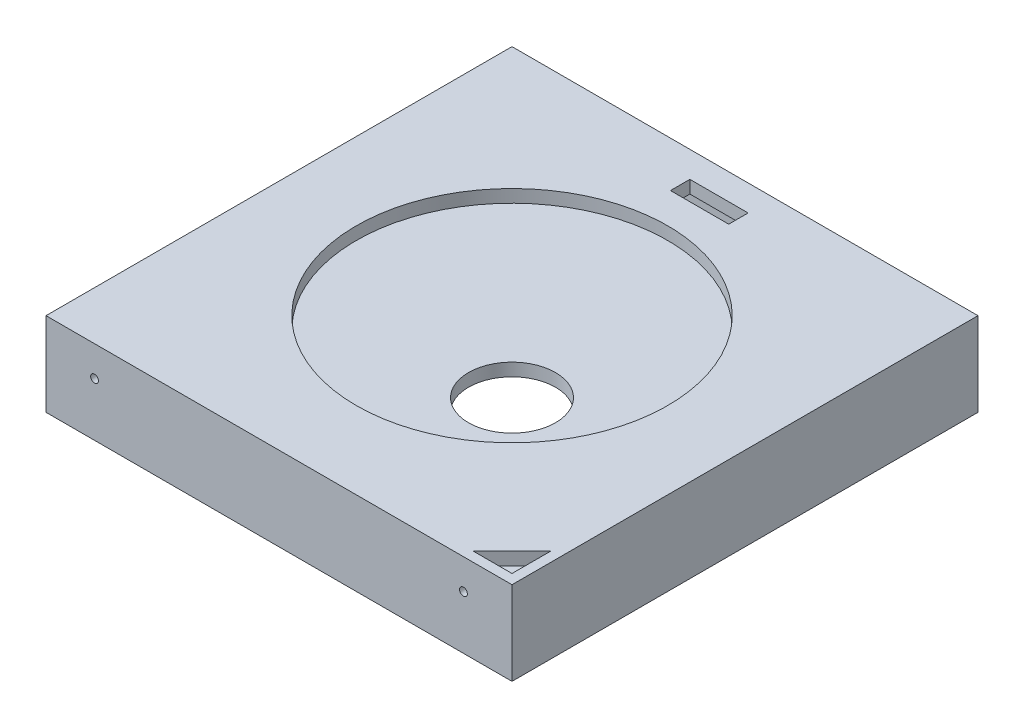
ISO-10303-21;
HEADER;
FILE_DESCRIPTION(('STEP AP214'),'2;1');
FILE_NAME('part.step','',(''),(''),'','','');
FILE_SCHEMA(('AUTOMOTIVE_DESIGN { 1 0 10303 214 1 1 1 1 }'));
ENDSEC;
DATA;
#1=APPLICATION_CONTEXT('core data for automotive mechanical design processes');
#2=APPLICATION_PROTOCOL_DEFINITION('international standard','automotive_design',2000,#1);
#3=PRODUCT_CONTEXT('',#1,'mechanical');
#4=PRODUCT('Part','Part','',(#3));
#5=PRODUCT_RELATED_PRODUCT_CATEGORY('part','',(#4));
#6=PRODUCT_DEFINITION_FORMATION('','',#4);
#7=PRODUCT_DEFINITION_CONTEXT('part definition',#1,'design');
#8=PRODUCT_DEFINITION('design','',#6,#7);
#9=PRODUCT_DEFINITION_SHAPE('','',#8);
#10=(LENGTH_UNIT() NAMED_UNIT(*) SI_UNIT(.MILLI.,.METRE.));
#11=(NAMED_UNIT(*) PLANE_ANGLE_UNIT() SI_UNIT($,.RADIAN.));
#12=(NAMED_UNIT(*) SI_UNIT($,.STERADIAN.) SOLID_ANGLE_UNIT());
#13=UNCERTAINTY_MEASURE_WITH_UNIT(LENGTH_MEASURE(1.E-05),#10,'distance_accuracy_value','');
#14=(GEOMETRIC_REPRESENTATION_CONTEXT(3) GLOBAL_UNCERTAINTY_ASSIGNED_CONTEXT((#13)) GLOBAL_UNIT_ASSIGNED_CONTEXT((#10,
#11,#12)) REPRESENTATION_CONTEXT('',''));
#15=CARTESIAN_POINT('',(0.,0.,0.));
#16=DIRECTION('',(0.,0.,1.));
#17=DIRECTION('',(1.,0.,0.));
#18=AXIS2_PLACEMENT_3D('',#15,#16,#17);
#19=CARTESIAN_POINT('',(134.387464788732,34.95802,177.746338028169));
#20=DIRECTION('',(0.,0.,1.));
#21=DIRECTION('',(1.,0.,0.));
#22=AXIS2_PLACEMENT_3D('',#19,#20,#21);
#23=CYLINDRICAL_SURFACE('',#22,2.53999999999998);
#24=CARTESIAN_POINT('',(134.387464788732,34.95802,209.496338028169));
#25=DIRECTION('',(0.,0.,1.));
#26=DIRECTION('',(1.,0.,0.));
#27=AXIS2_PLACEMENT_3D('',#24,#25,#26);
#28=CIRCLE('',#27,2.53999999999998);
#29=CARTESIAN_POINT('',(136.927464788732,34.95802,209.496338028169));
#30=VERTEX_POINT('',#29);
#31=EDGE_CURVE('E199',#30,#30,#28,.T.);
#32=ORIENTED_EDGE('',*,*,#31,.T.);
#33=EDGE_LOOP('',(#32));
#34=FACE_BOUND('',#33,.T.);
#35=CARTESIAN_POINT('',(134.387464788732,34.95802,203.146338028169));
#36=DIRECTION('',(0.,0.,1.));
#37=DIRECTION('',(1.,0.,0.));
#38=AXIS2_PLACEMENT_3D('',#35,#36,#37);
#39=CIRCLE('',#38,2.53999999999998);
#40=CARTESIAN_POINT('',(136.927464788732,34.95802,203.146338028169));
#41=VERTEX_POINT('',#40);
#42=EDGE_CURVE('E46',#41,#41,#39,.T.);
#43=ORIENTED_EDGE('',*,*,#42,.F.);
#44=EDGE_LOOP('',(#43));
#45=FACE_BOUND('',#44,.T.);
#46=ADVANCED_FACE('F37',(#34,#45),#23,.F.);
#47=CARTESIAN_POINT('',(-106.912535211268,34.95802,177.746338028169));
#48=DIRECTION('',(0.,0.,1.));
#49=DIRECTION('',(1.,0.,0.));
#50=AXIS2_PLACEMENT_3D('',#47,#48,#49);
#51=CYLINDRICAL_SURFACE('',#50,2.54);
#52=CARTESIAN_POINT('',(-106.912535211268,34.95802,209.496338028169));
#53=DIRECTION('',(0.,0.,1.));
#54=DIRECTION('',(1.,0.,0.));
#55=AXIS2_PLACEMENT_3D('',#52,#53,#54);
#56=CIRCLE('',#55,2.54);
#57=CARTESIAN_POINT('',(-104.372535211268,34.95802,209.496338028169));
#58=VERTEX_POINT('',#57);
#59=EDGE_CURVE('E198',#58,#58,#56,.T.);
#60=ORIENTED_EDGE('',*,*,#59,.T.);
#61=EDGE_LOOP('',(#60));
#62=FACE_BOUND('',#61,.T.);
#63=CARTESIAN_POINT('',(-106.912535211268,34.95802,203.146338028169));
#64=DIRECTION('',(0.,0.,-1.));
#65=DIRECTION('',(-1.,0.,0.));
#66=AXIS2_PLACEMENT_3D('',#63,#64,#65);
#67=CIRCLE('',#66,2.54);
#68=CARTESIAN_POINT('',(-109.452535211268,34.95802,203.146338028169));
#69=VERTEX_POINT('',#68);
#70=EDGE_CURVE('E151',#69,#69,#67,.F.);
#71=ORIENTED_EDGE('',*,*,#70,.F.);
#72=EDGE_LOOP('',(#71));
#73=FACE_BOUND('',#72,.T.);
#74=ADVANCED_FACE('F273',(#62,#73),#51,.F.);
#75=CARTESIAN_POINT('',(-138.662535211268,54.77002,-95.303661971831));
#76=DIRECTION('',(1.,0.,0.));
#77=DIRECTION('',(0.,0.,-1.));
#78=AXIS2_PLACEMENT_3D('',#75,#76,#77);
#79=PLANE('',#78);
#80=DIRECTION('',(0.,0.,1.));
#81=VECTOR('',#80,1.);
#82=CARTESIAN_POINT('',(-138.662535211268,0.,-95.303661971831));
#83=LINE('',#82,#81);
#84=CARTESIAN_POINT('',(-138.662535211268,0.,-95.303661971831));
#85=VERTEX_POINT('',#84);
#86=CARTESIAN_POINT('',(-138.662535211268,0.,209.496338028169));
#87=VERTEX_POINT('',#86);
#88=EDGE_CURVE('E237',#85,#87,#83,.T.);
#89=ORIENTED_EDGE('',*,*,#88,.T.);
#90=DIRECTION('',(0.,-1.,0.));
#91=VECTOR('',#90,1.);
#92=CARTESIAN_POINT('',(-138.662535211268,54.77002,209.496338028169));
#93=LINE('',#92,#91);
#94=CARTESIAN_POINT('',(-138.662535211268,54.77002,209.496338028169));
#95=VERTEX_POINT('',#94);
#96=EDGE_CURVE('E264',#95,#87,#93,.T.);
#97=ORIENTED_EDGE('',*,*,#96,.F.);
#98=DIRECTION('',(0.,0.,1.));
#99=VECTOR('',#98,1.);
#100=CARTESIAN_POINT('',(-138.662535211268,54.77002,-95.303661971831));
#101=LINE('',#100,#99);
#102=CARTESIAN_POINT('',(-138.662535211268,54.77002,-95.303661971831));
#103=VERTEX_POINT('',#102);
#104=EDGE_CURVE('E238',#103,#95,#101,.T.);
#105=ORIENTED_EDGE('',*,*,#104,.F.);
#106=DIRECTION('',(0.,-1.,0.));
#107=VECTOR('',#106,1.);
#108=CARTESIAN_POINT('',(-138.662535211268,54.77002,-95.303661971831));
#109=LINE('',#108,#107);
#110=EDGE_CURVE('E248',#103,#85,#109,.T.);
#111=ORIENTED_EDGE('',*,*,#110,.T.);
#112=EDGE_LOOP('',(#89,#97,#105,#111));
#113=FACE_BOUND('',#112,.T.);
#114=ADVANCED_FACE('F39',(#113),#79,.F.);
#115=CARTESIAN_POINT('',(-138.662535211268,54.77002,209.496338028169));
#116=DIRECTION('',(0.,0.,-1.));
#117=DIRECTION('',(-1.,0.,0.));
#118=AXIS2_PLACEMENT_3D('',#115,#116,#117);
#119=PLANE('',#118);
#120=ORIENTED_EDGE('',*,*,#31,.F.);
#121=EDGE_LOOP('',(#120));
#122=FACE_BOUND('',#121,.T.);
#123=ORIENTED_EDGE('',*,*,#59,.F.);
#124=EDGE_LOOP('',(#123));
#125=FACE_BOUND('',#124,.T.);
#126=DIRECTION('',(1.,0.,0.));
#127=VECTOR('',#126,1.);
#128=CARTESIAN_POINT('',(-138.662535211268,0.,209.496338028169));
#129=LINE('',#128,#127);
#130=CARTESIAN_POINT('',(166.137464788732,0.,209.496338028169));
#131=VERTEX_POINT('',#130);
#132=EDGE_CURVE('E251',#87,#131,#129,.T.);
#133=ORIENTED_EDGE('',*,*,#132,.T.);
#134=DIRECTION('',(0.,-1.,0.));
#135=VECTOR('',#134,1.);
#136=CARTESIAN_POINT('',(166.137464788732,54.77002,209.496338028169));
#137=LINE('',#136,#135);
#138=CARTESIAN_POINT('',(166.137464788732,54.77002,209.496338028169));
#139=VERTEX_POINT('',#138);
#140=EDGE_CURVE('E261',#139,#131,#137,.T.);
#141=ORIENTED_EDGE('',*,*,#140,.F.);
#142=DIRECTION('',(1.,0.,0.));
#143=VECTOR('',#142,1.);
#144=CARTESIAN_POINT('',(-138.662535211268,54.77002,209.496338028169));
#145=LINE('',#144,#143);
#146=EDGE_CURVE('E241',#95,#139,#145,.T.);
#147=ORIENTED_EDGE('',*,*,#146,.F.);
#148=ORIENTED_EDGE('',*,*,#96,.T.);
#149=EDGE_LOOP('',(#133,#141,#147,#148));
#150=FACE_BOUND('',#149,.T.);
#151=ADVANCED_FACE('F281',(#122,#125,#150),#119,.F.);
#152=CARTESIAN_POINT('',(166.137464788732,54.77002,-95.303661971831));
#153=DIRECTION('',(-1.,0.,0.));
#154=DIRECTION('',(0.,0.,1.));
#155=AXIS2_PLACEMENT_3D('',#152,#153,#154);
#156=PLANE('',#155);
#157=DIRECTION('',(0.,0.,-1.));
#158=VECTOR('',#157,1.);
#159=CARTESIAN_POINT('',(166.137464788732,0.,-95.303661971831));
#160=LINE('',#159,#158);
#161=CARTESIAN_POINT('',(166.137464788732,0.,-95.303661971831));
#162=VERTEX_POINT('',#161);
#163=EDGE_CURVE('E253',#131,#162,#160,.T.);
#164=ORIENTED_EDGE('',*,*,#163,.T.);
#165=DIRECTION('',(0.,-1.,0.));
#166=VECTOR('',#165,1.);
#167=CARTESIAN_POINT('',(166.137464788732,54.77002,-95.303661971831));
#168=LINE('',#167,#166);
#169=CARTESIAN_POINT('',(166.137464788732,54.77002,-95.303661971831));
#170=VERTEX_POINT('',#169);
#171=EDGE_CURVE('E258',#170,#162,#168,.T.);
#172=ORIENTED_EDGE('',*,*,#171,.F.);
#173=DIRECTION('',(0.,0.,-1.));
#174=VECTOR('',#173,1.);
#175=CARTESIAN_POINT('',(166.137464788732,54.77002,-95.303661971831));
#176=LINE('',#175,#174);
#177=EDGE_CURVE('E244',#139,#170,#176,.T.);
#178=ORIENTED_EDGE('',*,*,#177,.F.);
#179=ORIENTED_EDGE('',*,*,#140,.T.);
#180=EDGE_LOOP('',(#164,#172,#178,#179));
#181=FACE_BOUND('',#180,.T.);
#182=ADVANCED_FACE('F328',(#181),#156,.F.);
#183=CARTESIAN_POINT('',(-138.662535211268,54.77002,-95.303661971831));
#184=DIRECTION('',(0.,0.,1.));
#185=DIRECTION('',(1.,0.,0.));
#186=AXIS2_PLACEMENT_3D('',#183,#184,#185);
#187=PLANE('',#186);
#188=DIRECTION('',(-1.,0.,0.));
#189=VECTOR('',#188,1.);
#190=CARTESIAN_POINT('',(-138.662535211268,0.,-95.303661971831));
#191=LINE('',#190,#189);
#192=EDGE_CURVE('E242',#162,#85,#191,.T.);
#193=ORIENTED_EDGE('',*,*,#192,.T.);
#194=ORIENTED_EDGE('',*,*,#110,.F.);
#195=DIRECTION('',(-1.,0.,0.));
#196=VECTOR('',#195,1.);
#197=CARTESIAN_POINT('',(-138.662535211268,54.77002,-95.303661971831));
#198=LINE('',#197,#196);
#199=EDGE_CURVE('E246',#170,#103,#198,.T.);
#200=ORIENTED_EDGE('',*,*,#199,.F.);
#201=ORIENTED_EDGE('',*,*,#171,.T.);
#202=EDGE_LOOP('',(#193,#194,#200,#201));
#203=FACE_BOUND('',#202,.T.);
#204=ADVANCED_FACE('F321',(#203),#187,.F.);
#205=CARTESIAN_POINT('',(0.,54.77002,0.));
#206=DIRECTION('',(0.,1.,0.));
#207=DIRECTION('',(0.,0.,1.));
#208=AXIS2_PLACEMENT_3D('',#205,#206,#207);
#209=PLANE('',#208);
#210=DIRECTION('',(0.,0.,1.));
#211=VECTOR('',#210,1.);
#212=CARTESIAN_POINT('',(-5.31253521126755,54.77002,-78.2914207669556));
#213=LINE('',#212,#211);
#214=CARTESIAN_POINT('',(-5.31253521126755,54.77002,-78.2914207669556));
#215=VERTEX_POINT('',#214);
#216=CARTESIAN_POINT('',(-5.31253521126755,54.77002,-65.5914207669556));
#217=VERTEX_POINT('',#216);
#218=EDGE_CURVE('E211',#215,#217,#213,.T.);
#219=ORIENTED_EDGE('',*,*,#218,.F.);
#220=DIRECTION('',(-1.,0.,0.));
#221=VECTOR('',#220,1.);
#222=CARTESIAN_POINT('',(-5.31253521126755,54.77002,-78.2914207669556));
#223=LINE('',#222,#221);
#224=CARTESIAN_POINT('',(32.7874647887324,54.77002,-78.2914207669556));
#225=VERTEX_POINT('',#224);
#226=EDGE_CURVE('E221',#225,#215,#223,.T.);
#227=ORIENTED_EDGE('',*,*,#226,.F.);
#228=DIRECTION('',(0.,0.,-1.));
#229=VECTOR('',#228,1.);
#230=CARTESIAN_POINT('',(32.7874647887324,54.77002,-78.2914207669556));
#231=LINE('',#230,#229);
#232=CARTESIAN_POINT('',(32.7874647887325,54.77002,-65.5914207669556));
#233=VERTEX_POINT('',#232);
#234=EDGE_CURVE('E229',#233,#225,#231,.T.);
#235=ORIENTED_EDGE('',*,*,#234,.F.);
#236=DIRECTION('',(1.,0.,0.));
#237=VECTOR('',#236,1.);
#238=CARTESIAN_POINT('',(-5.31253521126755,54.77002,-65.5914207669556));
#239=LINE('',#238,#237);
#240=EDGE_CURVE('E232',#217,#233,#239,.T.);
#241=ORIENTED_EDGE('',*,*,#240,.F.);
#242=EDGE_LOOP('',(#219,#227,#235,#241));
#243=FACE_BOUND('',#242,.T.);
#244=DIRECTION('',(-0.707106781186547,0.,0.707106781186547));
#245=VECTOR('',#244,1.);
#246=CARTESIAN_POINT('',(159.787464788732,54.77002,177.746338028169));
#247=LINE('',#246,#245);
#248=CARTESIAN_POINT('',(159.787464788732,54.77002,177.746338028169));
#249=VERTEX_POINT('',#248);
#250=CARTESIAN_POINT('',(134.387464788732,54.77002,203.146338028169));
#251=VERTEX_POINT('',#250);
#252=EDGE_CURVE('E216',#249,#251,#247,.T.);
#253=ORIENTED_EDGE('',*,*,#252,.F.);
#254=DIRECTION('',(0.,0.,-1.));
#255=VECTOR('',#254,1.);
#256=CARTESIAN_POINT('',(159.787464788732,54.77002,203.146338028169));
#257=LINE('',#256,#255);
#258=CARTESIAN_POINT('',(159.787464788732,54.77002,203.146338028169));
#259=VERTEX_POINT('',#258);
#260=EDGE_CURVE('E207',#259,#249,#257,.T.);
#261=ORIENTED_EDGE('',*,*,#260,.F.);
#262=DIRECTION('',(1.,0.,0.));
#263=VECTOR('',#262,1.);
#264=CARTESIAN_POINT('',(134.387464788732,54.77002,203.146338028169));
#265=LINE('',#264,#263);
#266=EDGE_CURVE('E214',#251,#259,#265,.T.);
#267=ORIENTED_EDGE('',*,*,#266,.F.);
#268=EDGE_LOOP('',(#253,#261,#267));
#269=FACE_BOUND('',#268,.T.);
#270=CARTESIAN_POINT('',(13.7374647887325,54.77002,57.096338028169));
#271=DIRECTION('',(0.,1.,0.));
#272=DIRECTION('',(0.,0.,1.));
#273=AXIS2_PLACEMENT_3D('',#270,#271,#272);
#274=CIRCLE('',#273,101.854);
#275=CARTESIAN_POINT('',(13.7374647887325,54.77002,158.950338028169));
#276=VERTEX_POINT('',#275);
#277=EDGE_CURVE('E219',#276,#276,#274,.T.);
#278=ORIENTED_EDGE('',*,*,#277,.F.);
#279=EDGE_LOOP('',(#278));
#280=FACE_BOUND('',#279,.T.);
#281=ORIENTED_EDGE('',*,*,#104,.T.);
#282=ORIENTED_EDGE('',*,*,#146,.T.);
#283=ORIENTED_EDGE('',*,*,#177,.T.);
#284=ORIENTED_EDGE('',*,*,#199,.T.);
#285=EDGE_LOOP('',(#281,#282,#283,#284));
#286=FACE_BOUND('',#285,.T.);
#287=ADVANCED_FACE('F318',(#243,#269,#280,#286),#209,.T.);
#288=CARTESIAN_POINT('',(0.,0.,0.));
#289=DIRECTION('',(0.,1.,0.));
#290=DIRECTION('',(0.,0.,1.));
#291=AXIS2_PLACEMENT_3D('',#288,#289,#290);
#292=PLANE('',#291);
#293=CARTESIAN_POINT('',(13.7374647887325,0.,57.096338028169));
#294=DIRECTION('',(0.,-1.,0.));
#295=DIRECTION('',(0.,0.,-1.));
#296=AXIS2_PLACEMENT_3D('',#293,#294,#295);
#297=CIRCLE('',#296,28.448);
#298=CARTESIAN_POINT('',(13.7374647887325,0.,28.648338028169));
#299=VERTEX_POINT('',#298);
#300=EDGE_CURVE('E170',#299,#299,#297,.T.);
#301=ORIENTED_EDGE('',*,*,#300,.F.);
#302=EDGE_LOOP('',(#301));
#303=FACE_BOUND('',#302,.T.);
#304=ORIENTED_EDGE('',*,*,#88,.F.);
#305=ORIENTED_EDGE('',*,*,#192,.F.);
#306=ORIENTED_EDGE('',*,*,#163,.F.);
#307=ORIENTED_EDGE('',*,*,#132,.F.);
#308=EDGE_LOOP('',(#304,#305,#306,#307));
#309=FACE_BOUND('',#308,.T.);
#310=ADVANCED_FACE('F316',(#303,#309),#292,.F.);
#311=CARTESIAN_POINT('',(13.7374647887325,16.67002,57.096338028169));
#312=DIRECTION('',(0.,1.,0.));
#313=DIRECTION('',(0.,0.,1.));
#314=AXIS2_PLACEMENT_3D('',#311,#312,#313);
#315=CYLINDRICAL_SURFACE('',#314,101.854);
#316=CARTESIAN_POINT('',(13.7374647887325,46.43501,57.096338028169));
#317=DIRECTION('',(0.,1.,0.));
#318=DIRECTION('',(0.,0.,1.));
#319=AXIS2_PLACEMENT_3D('',#316,#317,#318);
#320=CIRCLE('',#319,101.854);
#321=CARTESIAN_POINT('',(13.7374647887325,46.43501,158.950338028169));
#322=VERTEX_POINT('',#321);
#323=EDGE_CURVE('E195',#322,#322,#320,.F.);
#324=CARTESIAN_POINT('',(13.7374647887325,46.43501,158.950338028169));
#325=CARTESIAN_POINT('',(13.7374647887325,46.5218330208333,158.950338028169));
#326=CARTESIAN_POINT('',(13.7374647887325,46.6086560416667,158.950338028169));
#327=CARTESIAN_POINT('',(13.7374647887325,46.7823020833333,158.950338028169));
#328=CARTESIAN_POINT('',(13.7374647887325,46.8691251041667,158.950338028169));
#329=CARTESIAN_POINT('',(13.7374647887325,47.0427711458333,158.950338028169));
#330=CARTESIAN_POINT('',(13.7374647887325,47.1295941666667,158.950338028169));
#331=CARTESIAN_POINT('',(13.7374647887325,47.3032402083333,158.950338028169));
#332=CARTESIAN_POINT('',(13.7374647887325,47.3900632291667,158.950338028169));
#333=CARTESIAN_POINT('',(13.7374647887325,47.5637092708333,158.950338028169));
#334=CARTESIAN_POINT('',(13.7374647887325,47.6505322916667,158.950338028169));
#335=CARTESIAN_POINT('',(13.7374647887325,47.8241783333333,158.950338028169));
#336=CARTESIAN_POINT('',(13.7374647887325,47.9110013541667,158.950338028169));
#337=CARTESIAN_POINT('',(13.7374647887325,48.0846473958333,158.950338028169));
#338=CARTESIAN_POINT('',(13.7374647887325,48.1714704166667,158.950338028169));
#339=CARTESIAN_POINT('',(13.7374647887325,48.3451164583333,158.950338028169));
#340=CARTESIAN_POINT('',(13.7374647887325,48.4319394791667,158.950338028169));
#341=CARTESIAN_POINT('',(13.7374647887325,48.6055855208333,158.950338028169));
#342=CARTESIAN_POINT('',(13.7374647887325,48.6924085416667,158.950338028169));
#343=CARTESIAN_POINT('',(13.7374647887325,48.8660545833333,158.950338028169));
#344=CARTESIAN_POINT('',(13.7374647887325,48.9528776041667,158.950338028169));
#345=CARTESIAN_POINT('',(13.7374647887325,49.1265236458333,158.950338028169));
#346=CARTESIAN_POINT('',(13.7374647887325,49.2133466666667,158.950338028169));
#347=CARTESIAN_POINT('',(13.7374647887325,49.3869927083333,158.950338028169));
#348=CARTESIAN_POINT('',(13.7374647887325,49.4738157291667,158.950338028169));
#349=CARTESIAN_POINT('',(13.7374647887325,49.6474617708333,158.950338028169));
#350=CARTESIAN_POINT('',(13.7374647887325,49.7342847916667,158.950338028169));
#351=CARTESIAN_POINT('',(13.7374647887325,49.9079308333333,158.950338028169));
#352=CARTESIAN_POINT('',(13.7374647887325,49.9947538541667,158.950338028169));
#353=CARTESIAN_POINT('',(13.7374647887325,50.1683998958333,158.950338028169));
#354=CARTESIAN_POINT('',(13.7374647887325,50.2552229166667,158.950338028169));
#355=CARTESIAN_POINT('',(13.7374647887325,50.4288689583333,158.950338028169));
#356=CARTESIAN_POINT('',(13.7374647887325,50.5156919791667,158.950338028169));
#357=CARTESIAN_POINT('',(13.7374647887325,50.6893380208333,158.950338028169));
#358=CARTESIAN_POINT('',(13.7374647887325,50.7761610416667,158.950338028169));
#359=CARTESIAN_POINT('',(13.7374647887325,50.9498070833333,158.950338028169));
#360=CARTESIAN_POINT('',(13.7374647887325,51.0366301041667,158.950338028169));
#361=CARTESIAN_POINT('',(13.7374647887325,51.2102761458333,158.950338028169));
#362=CARTESIAN_POINT('',(13.7374647887325,51.2970991666667,158.950338028169));
#363=CARTESIAN_POINT('',(13.7374647887325,51.4707452083333,158.950338028169));
#364=CARTESIAN_POINT('',(13.7374647887325,51.5575682291667,158.950338028169));
#365=CARTESIAN_POINT('',(13.7374647887325,51.7312142708333,158.950338028169));
#366=CARTESIAN_POINT('',(13.7374647887325,51.8180372916667,158.950338028169));
#367=CARTESIAN_POINT('',(13.7374647887325,51.9916833333333,158.950338028169));
#368=CARTESIAN_POINT('',(13.7374647887325,52.0785063541667,158.950338028169));
#369=CARTESIAN_POINT('',(13.7374647887325,52.2521523958333,158.950338028169));
#370=CARTESIAN_POINT('',(13.7374647887325,52.3389754166667,158.950338028169));
#371=CARTESIAN_POINT('',(13.7374647887325,52.5126214583333,158.950338028169));
#372=CARTESIAN_POINT('',(13.7374647887325,52.5994444791667,158.950338028169));
#373=CARTESIAN_POINT('',(13.7374647887325,52.7730905208333,158.950338028169));
#374=CARTESIAN_POINT('',(13.7374647887325,52.8599135416667,158.950338028169));
#375=CARTESIAN_POINT('',(13.7374647887325,53.0335595833333,158.950338028169));
#376=CARTESIAN_POINT('',(13.7374647887325,53.1203826041667,158.950338028169));
#377=CARTESIAN_POINT('',(13.7374647887325,53.2940286458333,158.950338028169));
#378=CARTESIAN_POINT('',(13.7374647887325,53.3808516666667,158.950338028169));
#379=CARTESIAN_POINT('',(13.7374647887325,53.5544977083333,158.950338028169));
#380=CARTESIAN_POINT('',(13.7374647887325,53.6413207291667,158.950338028169));
#381=CARTESIAN_POINT('',(13.7374647887325,53.8149667708333,158.950338028169));
#382=CARTESIAN_POINT('',(13.7374647887325,53.9017897916667,158.950338028169));
#383=CARTESIAN_POINT('',(13.7374647887325,54.0754358333333,158.950338028169));
#384=CARTESIAN_POINT('',(13.7374647887325,54.1622588541667,158.950338028169));
#385=CARTESIAN_POINT('',(13.7374647887325,54.3359048958333,158.950338028169));
#386=CARTESIAN_POINT('',(13.7374647887325,54.4227279166667,158.950338028169));
#387=CARTESIAN_POINT('',(13.7374647887325,54.5963739583333,158.950338028169));
#388=CARTESIAN_POINT('',(13.7374647887325,54.6831969791667,158.950338028169));
#389=CARTESIAN_POINT('',(13.7374647887325,54.77002,158.950338028169));
#390=B_SPLINE_CURVE_WITH_KNOTS('',3,(#324,#325,#326,#327,#328,#329,#330,#331,#332,#333,#334,
#335,#336,#337,#338,#339,#340,#341,#342,#343,#344,#345,#346,#347,#348,#349,#350,#351,#352,#353,
#354,#355,#356,#357,#358,#359,#360,#361,#362,#363,#364,#365,#366,#367,#368,#369,#370,#371,#372,
#373,#374,#375,#376,#377,#378,#379,#380,#381,#382,#383,#384,#385,#386,#387,#388,#389),
.UNSPECIFIED.,.F.,.F.,(4,2,2,2,2,2,2,2,2,2,2,2,2,2,2,2,2,2,2,2,2,2,2,2,2,2,2,2,2,2,2,2,4),(0.,
0.260469062499998,0.520938124999995,0.781407187499999,1.04187625,1.30234531249999,
1.56281437499999,1.8232834375,2.08375249999999,2.34422156249999,2.604690625,2.86515968749999,
3.12562874999999,3.3860978125,3.64656687499999,3.9070359375,4.16750499999999,4.42797406249999,
4.688443125,4.94891218749999,5.20938125,5.4698503125,5.73031937499999,5.9907884375,6.2512575,
6.51172656249999,6.772195625,7.0326646875,7.29313374999999,7.5536028125,7.81407187499999,
8.07454093749999,8.33501),.UNSPECIFIED.);
#391=EDGE_CURVE('BSEAM291',#322,#276,#390,.T.);
#392=ORIENTED_EDGE('',*,*,#323,.T.);
#393=ORIENTED_EDGE('',*,*,#277,.T.);
#394=ORIENTED_EDGE('',*,*,#391,.T.);
#395=ORIENTED_EDGE('',*,*,#391,.F.);
#396=EDGE_LOOP('',(#392,#394,#393,#395));
#397=FACE_BOUND('',#396,.T.);
#398=ADVANCED_FACE('F291',(#397),#315,.F.);
#399=CARTESIAN_POINT('',(159.787464788732,16.67002,177.746338028169));
#400=DIRECTION('',(-0.707106781186547,0.,-0.707106781186547));
#401=DIRECTION('',(-0.707106781186548,0.,0.707106781186548));
#402=AXIS2_PLACEMENT_3D('',#399,#400,#401);
#403=PLANE('',#402);
#404=DIRECTION('',(0.,1.,0.));
#405=VECTOR('',#404,1.);
#406=CARTESIAN_POINT('',(134.387464788732,16.67002,203.146338028169));
#407=LINE('',#406,#405);
#408=CARTESIAN_POINT('',(134.387464788732,46.43501,203.146338028169));
#409=VERTEX_POINT('',#408);
#410=EDGE_CURVE('E205',#409,#251,#407,.T.);
#411=ORIENTED_EDGE('',*,*,#410,.F.);
#412=DIRECTION('',(0.707106781186548,0.,-0.707106781186548));
#413=VECTOR('',#412,1.);
#414=CARTESIAN_POINT('',(159.787464788732,46.43501,177.746338028169));
#415=LINE('',#414,#413);
#416=CARTESIAN_POINT('',(159.787464788733,46.43501,177.746338028169));
#417=VERTEX_POINT('',#416);
#418=EDGE_CURVE('E192',#409,#417,#415,.T.);
#419=ORIENTED_EDGE('',*,*,#418,.T.);
#420=DIRECTION('',(0.,1.,0.));
#421=VECTOR('',#420,1.);
#422=CARTESIAN_POINT('',(159.787464788732,16.67002,177.746338028169));
#423=LINE('',#422,#421);
#424=EDGE_CURVE('E209',#417,#249,#423,.T.);
#425=ORIENTED_EDGE('',*,*,#424,.T.);
#426=ORIENTED_EDGE('',*,*,#252,.T.);
#427=EDGE_LOOP('',(#411,#419,#425,#426));
#428=FACE_BOUND('',#427,.T.);
#429=ADVANCED_FACE('F287',(#428),#403,.F.);
#430=CARTESIAN_POINT('',(159.787464788732,16.67002,203.146338028169));
#431=DIRECTION('',(1.,0.,0.));
#432=DIRECTION('',(0.,0.,-1.));
#433=AXIS2_PLACEMENT_3D('',#430,#431,#432);
#434=PLANE('',#433);
#435=ORIENTED_EDGE('',*,*,#424,.F.);
#436=DIRECTION('',(0.,0.,-1.));
#437=VECTOR('',#436,1.);
#438=CARTESIAN_POINT('',(159.787464788732,46.43501,-88.953661971831));
#439=LINE('',#438,#437);
#440=CARTESIAN_POINT('',(159.787464788732,46.43501,-88.953661971831));
#441=VERTEX_POINT('',#440);
#442=EDGE_CURVE('E178',#417,#441,#439,.T.);
#443=ORIENTED_EDGE('',*,*,#442,.T.);
#444=DIRECTION('',(0.,-1.,0.));
#445=VECTOR('',#444,1.);
#446=CARTESIAN_POINT('',(159.787464788732,46.43501,-88.953661971831));
#447=LINE('',#446,#445);
#448=CARTESIAN_POINT('',(159.787464788732,8.33501,-88.953661971831));
#449=VERTEX_POINT('',#448);
#450=EDGE_CURVE('E152',#441,#449,#447,.T.);
#451=ORIENTED_EDGE('',*,*,#450,.T.);
#452=DIRECTION('',(0.,0.,-1.));
#453=VECTOR('',#452,1.);
#454=CARTESIAN_POINT('',(159.787464788732,8.33501,-88.953661971831));
#455=LINE('',#454,#453);
#456=CARTESIAN_POINT('',(159.787464788733,8.33501,203.146338028169));
#457=VERTEX_POINT('',#456);
#458=EDGE_CURVE('E163',#457,#449,#455,.T.);
#459=ORIENTED_EDGE('',*,*,#458,.F.);
#460=DIRECTION('',(0.,1.,0.));
#461=VECTOR('',#460,1.);
#462=CARTESIAN_POINT('',(159.787464788732,16.67002,203.146338028169));
#463=LINE('',#462,#461);
#464=EDGE_CURVE('E159',#457,#259,#463,.T.);
#465=ORIENTED_EDGE('',*,*,#464,.T.);
#466=ORIENTED_EDGE('',*,*,#260,.T.);
#467=EDGE_LOOP('',(#435,#443,#451,#459,#465,#466));
#468=FACE_BOUND('',#467,.T.);
#469=ADVANCED_FACE('F290',(#468),#434,.F.);
#470=CARTESIAN_POINT('',(134.387464788732,16.67002,203.146338028169));
#471=DIRECTION('',(0.,0.,1.));
#472=DIRECTION('',(1.,0.,0.));
#473=AXIS2_PLACEMENT_3D('',#470,#471,#472);
#474=PLANE('',#473);
#475=DIRECTION('',(1.,0.,0.));
#476=VECTOR('',#475,1.);
#477=CARTESIAN_POINT('',(-132.312535211268,46.43501,203.146338028169));
#478=LINE('',#477,#476);
#479=CARTESIAN_POINT('',(-132.312535211268,46.43501,203.146338028169));
#480=VERTEX_POINT('',#479);
#481=EDGE_CURVE('E176',#480,#409,#478,.T.);
#482=ORIENTED_EDGE('',*,*,#481,.T.);
#483=ORIENTED_EDGE('',*,*,#410,.T.);
#484=ORIENTED_EDGE('',*,*,#266,.T.);
#485=ORIENTED_EDGE('',*,*,#464,.F.);
#486=DIRECTION('',(1.,0.,0.));
#487=VECTOR('',#486,1.);
#488=CARTESIAN_POINT('',(-132.312535211268,8.33501,203.146338028169));
#489=LINE('',#488,#487);
#490=CARTESIAN_POINT('',(-132.312535211268,8.33501,203.146338028169));
#491=VERTEX_POINT('',#490);
#492=EDGE_CURVE('E155',#491,#457,#489,.T.);
#493=ORIENTED_EDGE('',*,*,#492,.F.);
#494=DIRECTION('',(0.,-1.,0.));
#495=VECTOR('',#494,1.);
#496=CARTESIAN_POINT('',(-132.312535211268,46.43501,203.146338028169));
#497=LINE('',#496,#495);
#498=EDGE_CURVE('E140',#480,#491,#497,.T.);
#499=ORIENTED_EDGE('',*,*,#498,.F.);
#500=EDGE_LOOP('',(#482,#483,#484,#485,#493,#499));
#501=FACE_BOUND('',#500,.T.);
#502=ORIENTED_EDGE('',*,*,#42,.T.);
#503=EDGE_LOOP('',(#502));
#504=FACE_BOUND('',#503,.T.);
#505=ORIENTED_EDGE('',*,*,#70,.T.);
#506=EDGE_LOOP('',(#505));
#507=FACE_BOUND('',#506,.T.);
#508=ADVANCED_FACE('F156',(#501,#504,#507),#474,.F.);
#509=CARTESIAN_POINT('',(-5.31253521126755,16.67002,-78.2914207669556));
#510=DIRECTION('',(-1.,0.,0.));
#511=DIRECTION('',(0.,0.,1.));
#512=AXIS2_PLACEMENT_3D('',#509,#510,#511);
#513=PLANE('',#512);
#514=DIRECTION('',(0.,1.,0.));
#515=VECTOR('',#514,1.);
#516=CARTESIAN_POINT('',(-5.31253521126755,16.67002,-65.5914207669556));
#517=LINE('',#516,#515);
#518=CARTESIAN_POINT('',(-5.31253521126755,46.43501,-65.5914207669556));
#519=VERTEX_POINT('',#518);
#520=EDGE_CURVE('E59',#519,#217,#517,.T.);
#521=ORIENTED_EDGE('',*,*,#520,.F.);
#522=DIRECTION('',(0.,0.,-1.));
#523=VECTOR('',#522,1.);
#524=CARTESIAN_POINT('',(-5.31253521126755,46.43501,-78.2914207669556));
#525=LINE('',#524,#523);
#526=CARTESIAN_POINT('',(-5.31253521126755,46.43501,-78.2914207669556));
#527=VERTEX_POINT('',#526);
#528=EDGE_CURVE('E53',#519,#527,#525,.T.);
#529=ORIENTED_EDGE('',*,*,#528,.T.);
#530=DIRECTION('',(0.,1.,0.));
#531=VECTOR('',#530,1.);
#532=CARTESIAN_POINT('',(-5.31253521126755,16.67002,-78.2914207669556));
#533=LINE('',#532,#531);
#534=EDGE_CURVE('E202',#527,#215,#533,.T.);
#535=ORIENTED_EDGE('',*,*,#534,.T.);
#536=ORIENTED_EDGE('',*,*,#218,.T.);
#537=EDGE_LOOP('',(#521,#529,#535,#536));
#538=FACE_BOUND('',#537,.T.);
#539=ADVANCED_FACE('F295',(#538),#513,.F.);
#540=CARTESIAN_POINT('',(-5.31253521126755,16.67002,-78.2914207669556));
#541=DIRECTION('',(0.,0.,-1.));
#542=DIRECTION('',(-1.,0.,0.));
#543=AXIS2_PLACEMENT_3D('',#540,#541,#542);
#544=PLANE('',#543);
#545=ORIENTED_EDGE('',*,*,#534,.F.);
#546=DIRECTION('',(1.,0.,0.));
#547=VECTOR('',#546,1.);
#548=CARTESIAN_POINT('',(-5.31253521126755,46.43501,-78.2914207669556));
#549=LINE('',#548,#547);
#550=CARTESIAN_POINT('',(32.7874647887324,46.43501,-78.2914207669556));
#551=VERTEX_POINT('',#550);
#552=EDGE_CURVE('E188',#527,#551,#549,.T.);
#553=ORIENTED_EDGE('',*,*,#552,.T.);
#554=DIRECTION('',(0.,1.,0.));
#555=VECTOR('',#554,1.);
#556=CARTESIAN_POINT('',(32.7874647887324,16.67002,-78.2914207669556));
#557=LINE('',#556,#555);
#558=EDGE_CURVE('E224',#551,#225,#557,.T.);
#559=ORIENTED_EDGE('',*,*,#558,.T.);
#560=ORIENTED_EDGE('',*,*,#226,.T.);
#561=EDGE_LOOP('',(#545,#553,#559,#560));
#562=FACE_BOUND('',#561,.T.);
#563=ADVANCED_FACE('F301',(#562),#544,.F.);
#564=CARTESIAN_POINT('',(32.7874647887324,16.67002,-78.2914207669556));
#565=DIRECTION('',(1.,0.,0.));
#566=DIRECTION('',(0.,0.,-1.));
#567=AXIS2_PLACEMENT_3D('',#564,#565,#566);
#568=PLANE('',#567);
#569=ORIENTED_EDGE('',*,*,#558,.F.);
#570=DIRECTION('',(0.,0.,1.));
#571=VECTOR('',#570,1.);
#572=CARTESIAN_POINT('',(32.7874647887324,46.43501,-78.2914207669556));
#573=LINE('',#572,#571);
#574=CARTESIAN_POINT('',(32.7874647887325,46.43501,-65.5914207669556));
#575=VERTEX_POINT('',#574);
#576=EDGE_CURVE('E185',#551,#575,#573,.T.);
#577=ORIENTED_EDGE('',*,*,#576,.T.);
#578=DIRECTION('',(0.,1.,0.));
#579=VECTOR('',#578,1.);
#580=CARTESIAN_POINT('',(32.7874647887325,16.67002,-65.5914207669556));
#581=LINE('',#580,#579);
#582=EDGE_CURVE('E222',#575,#233,#581,.T.);
#583=ORIENTED_EDGE('',*,*,#582,.T.);
#584=ORIENTED_EDGE('',*,*,#234,.T.);
#585=EDGE_LOOP('',(#569,#577,#583,#584));
#586=FACE_BOUND('',#585,.T.);
#587=ADVANCED_FACE('F307',(#586),#568,.F.);
#588=CARTESIAN_POINT('',(-5.31253521126755,16.67002,-65.5914207669556));
#589=DIRECTION('',(0.,0.,1.));
#590=DIRECTION('',(1.,0.,0.));
#591=AXIS2_PLACEMENT_3D('',#588,#589,#590);
#592=PLANE('',#591);
#593=ORIENTED_EDGE('',*,*,#582,.F.);
#594=DIRECTION('',(-1.,0.,0.));
#595=VECTOR('',#594,1.);
#596=CARTESIAN_POINT('',(-5.31253521126755,46.43501,-65.5914207669556));
#597=LINE('',#596,#595);
#598=EDGE_CURVE('E11',#575,#519,#597,.T.);
#599=ORIENTED_EDGE('',*,*,#598,.T.);
#600=ORIENTED_EDGE('',*,*,#520,.T.);
#601=ORIENTED_EDGE('',*,*,#240,.T.);
#602=EDGE_LOOP('',(#593,#599,#600,#601));
#603=FACE_BOUND('',#602,.T.);
#604=ADVANCED_FACE('F303',(#603),#592,.F.);
#605=CARTESIAN_POINT('',(0.,46.43501,0.));
#606=DIRECTION('',(0.,1.,0.));
#607=DIRECTION('',(0.,0.,1.));
#608=AXIS2_PLACEMENT_3D('',#605,#606,#607);
#609=PLANE('',#608);
#610=ORIENTED_EDGE('',*,*,#481,.F.);
#611=DIRECTION('',(0.,0.,1.));
#612=VECTOR('',#611,1.);
#613=CARTESIAN_POINT('',(-132.312535211268,46.43501,-88.953661971831));
#614=LINE('',#613,#612);
#615=CARTESIAN_POINT('',(-132.312535211268,46.43501,-88.953661971831));
#616=VERTEX_POINT('',#615);
#617=EDGE_CURVE('E148',#616,#480,#614,.T.);
#618=ORIENTED_EDGE('',*,*,#617,.F.);
#619=DIRECTION('',(-1.,0.,0.));
#620=VECTOR('',#619,1.);
#621=CARTESIAN_POINT('',(-132.312535211268,46.43501,-88.953661971831));
#622=LINE('',#621,#620);
#623=EDGE_CURVE('E180',#441,#616,#622,.T.);
#624=ORIENTED_EDGE('',*,*,#623,.F.);
#625=ORIENTED_EDGE('',*,*,#442,.F.);
#626=ORIENTED_EDGE('',*,*,#418,.F.);
#627=EDGE_LOOP('',(#610,#618,#624,#625,#626));
#628=FACE_BOUND('',#627,.T.);
#629=ORIENTED_EDGE('',*,*,#598,.F.);
#630=ORIENTED_EDGE('',*,*,#576,.F.);
#631=ORIENTED_EDGE('',*,*,#552,.F.);
#632=ORIENTED_EDGE('',*,*,#528,.F.);
#633=EDGE_LOOP('',(#629,#630,#631,#632));
#634=FACE_BOUND('',#633,.T.);
#635=ORIENTED_EDGE('',*,*,#323,.F.);
#636=EDGE_LOOP('',(#635));
#637=FACE_BOUND('',#636,.T.);
#638=ADVANCED_FACE('F306',(#628,#634,#637),#609,.F.);
#639=CARTESIAN_POINT('',(-132.312535211268,46.43501,-88.953661971831));
#640=DIRECTION('',(1.,0.,0.));
#641=DIRECTION('',(0.,0.,-1.));
#642=AXIS2_PLACEMENT_3D('',#639,#640,#641);
#643=PLANE('',#642);
#644=DIRECTION('',(0.,-1.,0.));
#645=VECTOR('',#644,1.);
#646=CARTESIAN_POINT('',(-132.312535211268,46.43501,-88.953661971831));
#647=LINE('',#646,#645);
#648=CARTESIAN_POINT('',(-132.312535211268,8.33501,-88.953661971831));
#649=VERTEX_POINT('',#648);
#650=EDGE_CURVE('E182',#616,#649,#647,.T.);
#651=ORIENTED_EDGE('',*,*,#650,.F.);
#652=ORIENTED_EDGE('',*,*,#617,.T.);
#653=ORIENTED_EDGE('',*,*,#498,.T.);
#654=DIRECTION('',(0.,0.,1.));
#655=VECTOR('',#654,1.);
#656=CARTESIAN_POINT('',(-132.312535211268,8.33501,-88.953661971831));
#657=LINE('',#656,#655);
#658=EDGE_CURVE('E145',#649,#491,#657,.T.);
#659=ORIENTED_EDGE('',*,*,#658,.F.);
#660=EDGE_LOOP('',(#651,#652,#653,#659));
#661=FACE_BOUND('',#660,.T.);
#662=ADVANCED_FACE('F143',(#661),#643,.T.);
#663=CARTESIAN_POINT('',(-132.312535211268,46.43501,-88.953661971831));
#664=DIRECTION('',(0.,0.,1.));
#665=DIRECTION('',(1.,0.,0.));
#666=AXIS2_PLACEMENT_3D('',#663,#664,#665);
#667=PLANE('',#666);
#668=ORIENTED_EDGE('',*,*,#450,.F.);
#669=ORIENTED_EDGE('',*,*,#623,.T.);
#670=ORIENTED_EDGE('',*,*,#650,.T.);
#671=DIRECTION('',(-1.,0.,0.));
#672=VECTOR('',#671,1.);
#673=CARTESIAN_POINT('',(-132.312535211268,8.33501,-88.953661971831));
#674=LINE('',#673,#672);
#675=EDGE_CURVE('E167',#449,#649,#674,.T.);
#676=ORIENTED_EDGE('',*,*,#675,.F.);
#677=EDGE_LOOP('',(#668,#669,#670,#676));
#678=FACE_BOUND('',#677,.T.);
#679=ADVANCED_FACE('F420',(#678),#667,.T.);
#680=CARTESIAN_POINT('',(0.,8.33501,0.));
#681=DIRECTION('',(0.,1.,0.));
#682=DIRECTION('',(0.,0.,1.));
#683=AXIS2_PLACEMENT_3D('',#680,#681,#682);
#684=PLANE('',#683);
#685=CARTESIAN_POINT('',(13.7374647887325,8.33501,57.096338028169));
#686=DIRECTION('',(0.,1.,0.));
#687=DIRECTION('',(0.,0.,1.));
#688=AXIS2_PLACEMENT_3D('',#685,#686,#687);
#689=CIRCLE('',#688,28.448);
#690=CARTESIAN_POINT('',(13.7374647887325,8.33501,85.5443380281691));
#691=VERTEX_POINT('',#690);
#692=EDGE_CURVE('E41',#691,#691,#689,.T.);
#693=ORIENTED_EDGE('',*,*,#692,.F.);
#694=EDGE_LOOP('',(#693));
#695=FACE_BOUND('',#694,.T.);
#696=ORIENTED_EDGE('',*,*,#658,.T.);
#697=ORIENTED_EDGE('',*,*,#492,.T.);
#698=ORIENTED_EDGE('',*,*,#458,.T.);
#699=ORIENTED_EDGE('',*,*,#675,.T.);
#700=EDGE_LOOP('',(#696,#697,#698,#699));
#701=FACE_BOUND('',#700,.T.);
#702=ADVANCED_FACE('F165',(#695,#701),#684,.T.);
#703=CARTESIAN_POINT('',(13.7374647887325,54.77002,57.096338028169));
#704=DIRECTION('',(0.,-1.,0.));
#705=DIRECTION('',(0.,0.,-1.));
#706=AXIS2_PLACEMENT_3D('',#703,#704,#705);
#707=CYLINDRICAL_SURFACE('',#706,28.448);
#708=ORIENTED_EDGE('',*,*,#692,.T.);
#709=EDGE_LOOP('',(#708));
#710=FACE_BOUND('',#709,.T.);
#711=ORIENTED_EDGE('',*,*,#300,.T.);
#712=EDGE_LOOP('',(#711));
#713=FACE_BOUND('',#712,.T.);
#714=ADVANCED_FACE('F431',(#710,#713),#707,.F.);
#715=CLOSED_SHELL('',(#46,#74,#114,#151,#182,#204,#287,#310,#398,#429,#469,#508,#539,#563,#587,
#604,#638,#662,#679,#702,#714));
#716=MANIFOLD_SOLID_BREP('B2',#715);
#717=ADVANCED_BREP_SHAPE_REPRESENTATION('',(#18,#716),#14);
#718=SHAPE_DEFINITION_REPRESENTATION(#9,#717);
ENDSEC;
END-ISO-10303-21;
